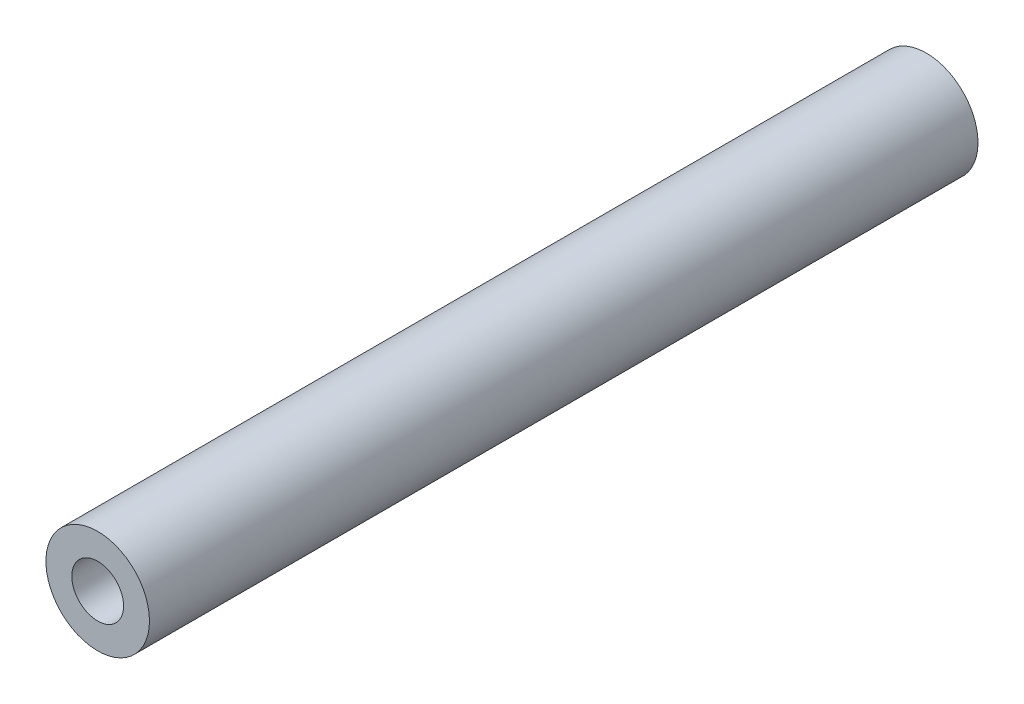
ISO-10303-21;
HEADER;
FILE_DESCRIPTION(('STEP AP214'),'2;1');
FILE_NAME('part.step','',(''),(''),'','','');
FILE_SCHEMA(('AUTOMOTIVE_DESIGN { 1 0 10303 214 1 1 1 1 }'));
ENDSEC;
DATA;
#1=APPLICATION_CONTEXT('core data for automotive mechanical design processes');
#2=APPLICATION_PROTOCOL_DEFINITION('international standard','automotive_design',2000,#1);
#3=PRODUCT_CONTEXT('',#1,'mechanical');
#4=PRODUCT('Part','Part','',(#3));
#5=PRODUCT_RELATED_PRODUCT_CATEGORY('part','',(#4));
#6=PRODUCT_DEFINITION_FORMATION('','',#4);
#7=PRODUCT_DEFINITION_CONTEXT('part definition',#1,'design');
#8=PRODUCT_DEFINITION('design','',#6,#7);
#9=PRODUCT_DEFINITION_SHAPE('','',#8);
#10=(LENGTH_UNIT() NAMED_UNIT(*) SI_UNIT(.MILLI.,.METRE.));
#11=(NAMED_UNIT(*) PLANE_ANGLE_UNIT() SI_UNIT($,.RADIAN.));
#12=(NAMED_UNIT(*) SI_UNIT($,.STERADIAN.) SOLID_ANGLE_UNIT());
#13=UNCERTAINTY_MEASURE_WITH_UNIT(LENGTH_MEASURE(1.E-05),#10,'distance_accuracy_value','');
#14=(GEOMETRIC_REPRESENTATION_CONTEXT(3) GLOBAL_UNCERTAINTY_ASSIGNED_CONTEXT((#13)) GLOBAL_UNIT_ASSIGNED_CONTEXT((#10,
#11,#12)) REPRESENTATION_CONTEXT('',''));
#15=CARTESIAN_POINT('',(0.,0.,0.));
#16=DIRECTION('',(0.,0.,1.));
#17=DIRECTION('',(1.,0.,0.));
#18=AXIS2_PLACEMENT_3D('',#15,#16,#17);
#19=CARTESIAN_POINT('',(0.,0.,32.));
#20=DIRECTION('',(0.,0.,1.));
#21=DIRECTION('',(1.,0.,0.));
#22=AXIS2_PLACEMENT_3D('',#19,#20,#21);
#23=PLANE('',#22);
#24=CARTESIAN_POINT('',(0.,0.,32.));
#25=DIRECTION('',(0.,0.,1.));
#26=DIRECTION('',(1.,0.,0.));
#27=AXIS2_PLACEMENT_3D('',#24,#25,#26);
#28=CIRCLE('',#27,4.);
#29=CARTESIAN_POINT('',(4.,0.,32.));
#30=VERTEX_POINT('',#29);
#31=EDGE_CURVE('E10',#30,#30,#28,.T.);
#32=ORIENTED_EDGE('',*,*,#31,.T.);
#33=EDGE_LOOP('',(#32));
#34=FACE_BOUND('',#33,.T.);
#35=CARTESIAN_POINT('',(0.,0.,32.));
#36=DIRECTION('',(0.,0.,1.));
#37=DIRECTION('',(1.,0.,0.));
#38=AXIS2_PLACEMENT_3D('',#35,#36,#37);
#39=CIRCLE('',#38,2.);
#40=CARTESIAN_POINT('',(2.,0.,32.));
#41=VERTEX_POINT('',#40);
#42=EDGE_CURVE('E44',#41,#41,#39,.T.);
#43=ORIENTED_EDGE('',*,*,#42,.F.);
#44=EDGE_LOOP('',(#43));
#45=FACE_BOUND('',#44,.T.);
#46=ADVANCED_FACE('F33',(#34,#45),#23,.T.);
#47=CARTESIAN_POINT('',(0.,0.,-32.));
#48=DIRECTION('',(0.,0.,1.));
#49=DIRECTION('',(1.,0.,0.));
#50=AXIS2_PLACEMENT_3D('',#47,#48,#49);
#51=PLANE('',#50);
#52=CARTESIAN_POINT('',(0.,0.,-32.));
#53=DIRECTION('',(0.,0.,1.));
#54=DIRECTION('',(1.,0.,0.));
#55=AXIS2_PLACEMENT_3D('',#52,#53,#54);
#56=CIRCLE('',#55,4.);
#57=CARTESIAN_POINT('',(4.,0.,-32.));
#58=VERTEX_POINT('',#57);
#59=EDGE_CURVE('E37',#58,#58,#56,.T.);
#60=ORIENTED_EDGE('',*,*,#59,.F.);
#61=EDGE_LOOP('',(#60));
#62=FACE_BOUND('',#61,.T.);
#63=CARTESIAN_POINT('',(0.,0.,-32.));
#64=DIRECTION('',(0.,0.,1.));
#65=DIRECTION('',(1.,0.,0.));
#66=AXIS2_PLACEMENT_3D('',#63,#64,#65);
#67=CIRCLE('',#66,2.);
#68=CARTESIAN_POINT('',(2.,0.,-32.));
#69=VERTEX_POINT('',#68);
#70=EDGE_CURVE('E46',#69,#69,#67,.T.);
#71=ORIENTED_EDGE('',*,*,#70,.T.);
#72=EDGE_LOOP('',(#71));
#73=FACE_BOUND('',#72,.T.);
#74=ADVANCED_FACE('F56',(#62,#73),#51,.F.);
#75=CARTESIAN_POINT('',(0.,0.,32.));
#76=DIRECTION('',(0.,0.,-1.));
#77=DIRECTION('',(-1.,0.,0.));
#78=AXIS2_PLACEMENT_3D('',#75,#76,#77);
#79=CYLINDRICAL_SURFACE('',#78,4.);
#80=ORIENTED_EDGE('',*,*,#31,.F.);
#81=EDGE_LOOP('',(#80));
#82=FACE_BOUND('',#81,.T.);
#83=ORIENTED_EDGE('',*,*,#59,.T.);
#84=EDGE_LOOP('',(#83));
#85=FACE_BOUND('',#84,.T.);
#86=ADVANCED_FACE('F35',(#82,#85),#79,.T.);
#87=CARTESIAN_POINT('',(0.,0.,32.));
#88=DIRECTION('',(0.,0.,-1.));
#89=DIRECTION('',(-1.,0.,0.));
#90=AXIS2_PLACEMENT_3D('',#87,#88,#89);
#91=CYLINDRICAL_SURFACE('',#90,2.);
#92=ORIENTED_EDGE('',*,*,#42,.T.);
#93=EDGE_LOOP('',(#92));
#94=FACE_BOUND('',#93,.T.);
#95=ORIENTED_EDGE('',*,*,#70,.F.);
#96=EDGE_LOOP('',(#95));
#97=FACE_BOUND('',#96,.T.);
#98=ADVANCED_FACE('F52',(#94,#97),#91,.F.);
#99=CLOSED_SHELL('',(#46,#74,#86,#98));
#100=MANIFOLD_SOLID_BREP('B2',#99);
#101=ADVANCED_BREP_SHAPE_REPRESENTATION('',(#18,#100),#14);
#102=SHAPE_DEFINITION_REPRESENTATION(#9,#101);
ENDSEC;
END-ISO-10303-21;
